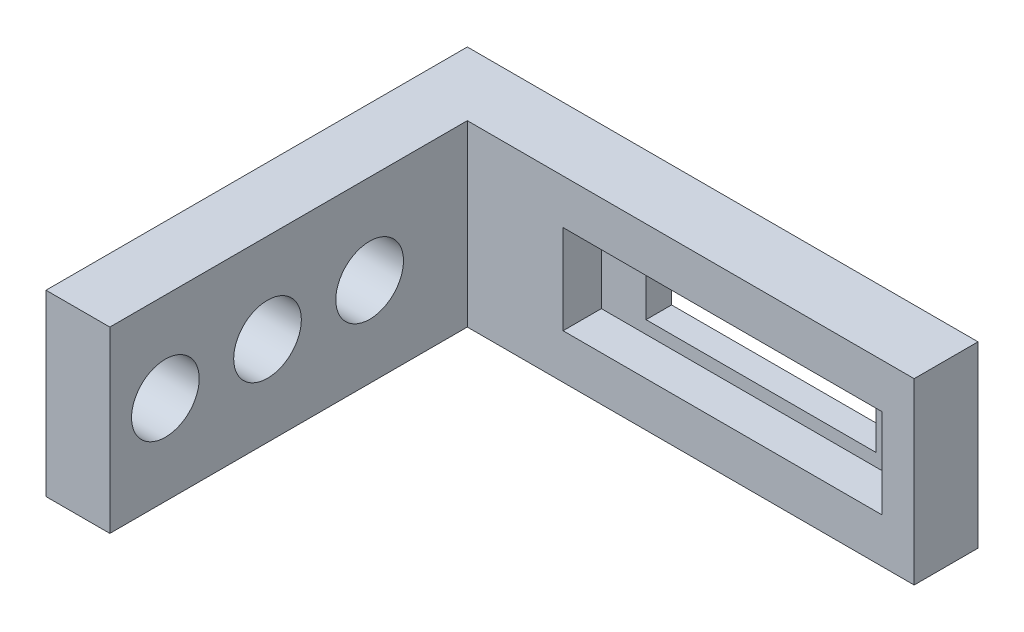
ISO-10303-21;
HEADER;
FILE_DESCRIPTION(('STEP AP214'),'2;1');
FILE_NAME('part.step','',(''),(''),'','','');
FILE_SCHEMA(('AUTOMOTIVE_DESIGN { 1 0 10303 214 1 1 1 1 }'));
ENDSEC;
DATA;
#1=APPLICATION_CONTEXT('core data for automotive mechanical design processes');
#2=APPLICATION_PROTOCOL_DEFINITION('international standard','automotive_design',2000,#1);
#3=PRODUCT_CONTEXT('',#1,'mechanical');
#4=PRODUCT('Part','Part','',(#3));
#5=PRODUCT_RELATED_PRODUCT_CATEGORY('part','',(#4));
#6=PRODUCT_DEFINITION_FORMATION('','',#4);
#7=PRODUCT_DEFINITION_CONTEXT('part definition',#1,'design');
#8=PRODUCT_DEFINITION('design','',#6,#7);
#9=PRODUCT_DEFINITION_SHAPE('','',#8);
#10=(LENGTH_UNIT() NAMED_UNIT(*) SI_UNIT(.MILLI.,.METRE.));
#11=(NAMED_UNIT(*) PLANE_ANGLE_UNIT() SI_UNIT($,.RADIAN.));
#12=(NAMED_UNIT(*) SI_UNIT($,.STERADIAN.) SOLID_ANGLE_UNIT());
#13=UNCERTAINTY_MEASURE_WITH_UNIT(LENGTH_MEASURE(1.E-05),#10,'distance_accuracy_value','');
#14=(GEOMETRIC_REPRESENTATION_CONTEXT(3) GLOBAL_UNCERTAINTY_ASSIGNED_CONTEXT((#13)) GLOBAL_UNIT_ASSIGNED_CONTEXT((#10,
#11,#12)) REPRESENTATION_CONTEXT('',''));
#15=CARTESIAN_POINT('',(0.,0.,0.));
#16=DIRECTION('',(0.,0.,1.));
#17=DIRECTION('',(1.,0.,0.));
#18=AXIS2_PLACEMENT_3D('',#15,#16,#17);
#19=CARTESIAN_POINT('',(10.,14.,-4.));
#20=DIRECTION('',(0.,0.,-1.));
#21=DIRECTION('',(-1.,0.,0.));
#22=AXIS2_PLACEMENT_3D('',#19,#20,#21);
#23=PLANE('',#22);
#24=DIRECTION('',(-1.,0.,0.));
#25=VECTOR('',#24,1.);
#26=CARTESIAN_POINT('',(37.5,10.5,-4.));
#27=LINE('',#26,#25);
#28=CARTESIAN_POINT('',(37.5,10.5,-4.));
#29=VERTEX_POINT('',#28);
#30=CARTESIAN_POINT('',(12.5,10.5,-4.));
#31=VERTEX_POINT('',#30);
#32=EDGE_CURVE('E268',#29,#31,#27,.T.);
#33=ORIENTED_EDGE('',*,*,#32,.F.);
#34=DIRECTION('',(0.,1.,0.));
#35=VECTOR('',#34,1.);
#36=CARTESIAN_POINT('',(37.5,3.50000000000001,-4.));
#37=LINE('',#36,#35);
#38=CARTESIAN_POINT('',(37.5,3.50000000000001,-4.));
#39=VERTEX_POINT('',#38);
#40=EDGE_CURVE('E239',#39,#29,#37,.T.);
#41=ORIENTED_EDGE('',*,*,#40,.F.);
#42=DIRECTION('',(1.,0.,0.));
#43=VECTOR('',#42,1.);
#44=CARTESIAN_POINT('',(37.5,3.50000000000001,-4.));
#45=LINE('',#44,#43);
#46=CARTESIAN_POINT('',(12.5,3.49999999999999,-4.));
#47=VERTEX_POINT('',#46);
#48=EDGE_CURVE('E253',#47,#39,#45,.T.);
#49=ORIENTED_EDGE('',*,*,#48,.F.);
#50=DIRECTION('',(0.,-1.,0.));
#51=VECTOR('',#50,1.);
#52=CARTESIAN_POINT('',(12.5,3.49999999999999,-4.));
#53=LINE('',#52,#51);
#54=EDGE_CURVE('E272',#31,#47,#53,.T.);
#55=ORIENTED_EDGE('',*,*,#54,.F.);
#56=EDGE_LOOP('',(#33,#41,#49,#55));
#57=FACE_BOUND('',#56,.T.);
#58=DIRECTION('',(1.,0.,0.));
#59=VECTOR('',#58,1.);
#60=CARTESIAN_POINT('',(10.,0.,-4.));
#61=LINE('',#60,#59);
#62=CARTESIAN_POINT('',(5.,0.,-4.));
#63=VERTEX_POINT('',#62);
#64=CARTESIAN_POINT('',(40.,0.,-4.));
#65=VERTEX_POINT('',#64);
#66=EDGE_CURVE('E139',#63,#65,#61,.T.);
#67=ORIENTED_EDGE('',*,*,#66,.T.);
#68=DIRECTION('',(0.,-1.,0.));
#69=VECTOR('',#68,1.);
#70=CARTESIAN_POINT('',(40.,14.,-4.));
#71=LINE('',#70,#69);
#72=CARTESIAN_POINT('',(40.,14.,-4.));
#73=VERTEX_POINT('',#72);
#74=EDGE_CURVE('E11',#73,#65,#71,.T.);
#75=ORIENTED_EDGE('',*,*,#74,.F.);
#76=DIRECTION('',(1.,0.,0.));
#77=VECTOR('',#76,1.);
#78=CARTESIAN_POINT('',(10.,14.,-4.));
#79=LINE('',#78,#77);
#80=CARTESIAN_POINT('',(5.,14.,-4.));
#81=VERTEX_POINT('',#80);
#82=EDGE_CURVE('E163',#81,#73,#79,.T.);
#83=ORIENTED_EDGE('',*,*,#82,.F.);
#84=DIRECTION('',(0.,1.,0.));
#85=VECTOR('',#84,1.);
#86=CARTESIAN_POINT('',(5.,0.,-4.));
#87=LINE('',#86,#85);
#88=EDGE_CURVE('E156',#63,#81,#87,.T.);
#89=ORIENTED_EDGE('',*,*,#88,.F.);
#90=EDGE_LOOP('',(#67,#75,#83,#89));
#91=FACE_BOUND('',#90,.T.);
#92=ADVANCED_FACE('F39',(#57,#91),#23,.F.);
#93=CARTESIAN_POINT('',(40.,14.,-9.));
#94=DIRECTION('',(-1.,0.,0.));
#95=DIRECTION('',(0.,0.,1.));
#96=AXIS2_PLACEMENT_3D('',#93,#94,#95);
#97=PLANE('',#96);
#98=DIRECTION('',(0.,0.,-1.));
#99=VECTOR('',#98,1.);
#100=CARTESIAN_POINT('',(40.,0.,-9.));
#101=LINE('',#100,#99);
#102=CARTESIAN_POINT('',(40.,0.,-9.));
#103=VERTEX_POINT('',#102);
#104=EDGE_CURVE('E145',#65,#103,#101,.T.);
#105=ORIENTED_EDGE('',*,*,#104,.T.);
#106=DIRECTION('',(0.,-1.,0.));
#107=VECTOR('',#106,1.);
#108=CARTESIAN_POINT('',(40.,14.,-9.));
#109=LINE('',#108,#107);
#110=CARTESIAN_POINT('',(40.,14.,-9.));
#111=VERTEX_POINT('',#110);
#112=EDGE_CURVE('E47',#111,#103,#109,.T.);
#113=ORIENTED_EDGE('',*,*,#112,.F.);
#114=DIRECTION('',(0.,0.,-1.));
#115=VECTOR('',#114,1.);
#116=CARTESIAN_POINT('',(40.,14.,-9.));
#117=LINE('',#116,#115);
#118=EDGE_CURVE('E292',#73,#111,#117,.T.);
#119=ORIENTED_EDGE('',*,*,#118,.F.);
#120=ORIENTED_EDGE('',*,*,#74,.T.);
#121=EDGE_LOOP('',(#105,#113,#119,#120));
#122=FACE_BOUND('',#121,.T.);
#123=ADVANCED_FACE('F321',(#122),#97,.F.);
#124=CARTESIAN_POINT('',(0.,14.,-9.));
#125=DIRECTION('',(0.,0.,1.));
#126=DIRECTION('',(1.,0.,0.));
#127=AXIS2_PLACEMENT_3D('',#124,#125,#126);
#128=PLANE('',#127);
#129=DIRECTION('',(-1.,0.,0.));
#130=VECTOR('',#129,1.);
#131=CARTESIAN_POINT('',(34.,9.50000000000001,-9.));
#132=LINE('',#131,#130);
#133=CARTESIAN_POINT('',(34.,9.50000000000001,-9.));
#134=VERTEX_POINT('',#133);
#135=CARTESIAN_POINT('',(16.,9.50000000000001,-9.));
#136=VERTEX_POINT('',#135);
#137=EDGE_CURVE('E219',#134,#136,#132,.T.);
#138=ORIENTED_EDGE('',*,*,#137,.T.);
#139=DIRECTION('',(0.,-1.,0.));
#140=VECTOR('',#139,1.);
#141=CARTESIAN_POINT('',(16.,9.50000000000001,-9.));
#142=LINE('',#141,#140);
#143=CARTESIAN_POINT('',(16.,4.5,-9.));
#144=VERTEX_POINT('',#143);
#145=EDGE_CURVE('E208',#136,#144,#142,.T.);
#146=ORIENTED_EDGE('',*,*,#145,.T.);
#147=DIRECTION('',(1.,0.,0.));
#148=VECTOR('',#147,1.);
#149=CARTESIAN_POINT('',(34.,4.50000000000001,-9.));
#150=LINE('',#149,#148);
#151=CARTESIAN_POINT('',(34.,4.50000000000001,-9.));
#152=VERTEX_POINT('',#151);
#153=EDGE_CURVE('E212',#144,#152,#150,.T.);
#154=ORIENTED_EDGE('',*,*,#153,.T.);
#155=DIRECTION('',(0.,1.,0.));
#156=VECTOR('',#155,1.);
#157=CARTESIAN_POINT('',(34.,9.50000000000001,-9.));
#158=LINE('',#157,#156);
#159=EDGE_CURVE('E59',#152,#134,#158,.T.);
#160=ORIENTED_EDGE('',*,*,#159,.T.);
#161=EDGE_LOOP('',(#138,#146,#154,#160));
#162=FACE_BOUND('',#161,.T.);
#163=DIRECTION('',(-1.,0.,0.));
#164=VECTOR('',#163,1.);
#165=CARTESIAN_POINT('',(0.,0.,-9.));
#166=LINE('',#165,#164);
#167=CARTESIAN_POINT('',(0.,0.,-9.));
#168=VERTEX_POINT('',#167);
#169=EDGE_CURVE('E305',#103,#168,#166,.T.);
#170=ORIENTED_EDGE('',*,*,#169,.T.);
#171=DIRECTION('',(0.,-1.,0.));
#172=VECTOR('',#171,1.);
#173=CARTESIAN_POINT('',(0.,14.,-9.));
#174=LINE('',#173,#172);
#175=CARTESIAN_POINT('',(0.,14.,-9.));
#176=VERTEX_POINT('',#175);
#177=EDGE_CURVE('E301',#176,#168,#174,.T.);
#178=ORIENTED_EDGE('',*,*,#177,.F.);
#179=DIRECTION('',(-1.,0.,0.));
#180=VECTOR('',#179,1.);
#181=CARTESIAN_POINT('',(11.5890955973018,14.,-9.));
#182=LINE('',#181,#180);
#183=EDGE_CURVE('E296',#111,#176,#182,.T.);
#184=ORIENTED_EDGE('',*,*,#183,.F.);
#185=ORIENTED_EDGE('',*,*,#112,.T.);
#186=EDGE_LOOP('',(#170,#178,#184,#185));
#187=FACE_BOUND('',#186,.T.);
#188=ADVANCED_FACE('F317',(#162,#187),#128,.F.);
#189=CARTESIAN_POINT('',(0.,14.,0.));
#190=DIRECTION('',(1.,0.,0.));
#191=DIRECTION('',(0.,0.,-1.));
#192=AXIS2_PLACEMENT_3D('',#189,#190,#191);
#193=PLANE('',#192);
#194=CARTESIAN_POINT('',(0.,6.99999999999999,3.65));
#195=DIRECTION('',(-1.,0.,0.));
#196=DIRECTION('',(0.,0.,1.));
#197=AXIS2_PLACEMENT_3D('',#194,#195,#196);
#198=CIRCLE('',#197,2.65);
#199=CARTESIAN_POINT('',(0.,6.99999999999999,6.3));
#200=VERTEX_POINT('',#199);
#201=EDGE_CURVE('E177',#200,#200,#198,.T.);
#202=ORIENTED_EDGE('',*,*,#201,.F.);
#203=EDGE_LOOP('',(#202));
#204=FACE_BOUND('',#203,.T.);
#205=CARTESIAN_POINT('',(0.,6.99999999999999,11.65));
#206=DIRECTION('',(-1.,0.,0.));
#207=DIRECTION('',(0.,0.,1.));
#208=AXIS2_PLACEMENT_3D('',#205,#206,#207);
#209=CIRCLE('',#208,2.65);
#210=CARTESIAN_POINT('',(0.,6.99999999999999,14.3));
#211=VERTEX_POINT('',#210);
#212=EDGE_CURVE('E178',#211,#211,#209,.T.);
#213=ORIENTED_EDGE('',*,*,#212,.F.);
#214=EDGE_LOOP('',(#213));
#215=FACE_BOUND('',#214,.T.);
#216=CARTESIAN_POINT('',(0.,6.99999999999999,19.65));
#217=DIRECTION('',(-1.,0.,0.));
#218=DIRECTION('',(0.,0.,1.));
#219=AXIS2_PLACEMENT_3D('',#216,#217,#218);
#220=CIRCLE('',#219,2.65);
#221=CARTESIAN_POINT('',(0.,6.99999999999999,22.3));
#222=VERTEX_POINT('',#221);
#223=EDGE_CURVE('E170',#222,#222,#220,.T.);
#224=ORIENTED_EDGE('',*,*,#223,.F.);
#225=EDGE_LOOP('',(#224));
#226=FACE_BOUND('',#225,.T.);
#227=DIRECTION('',(0.,0.,1.));
#228=VECTOR('',#227,1.);
#229=CARTESIAN_POINT('',(0.,0.,0.));
#230=LINE('',#229,#228);
#231=CARTESIAN_POINT('',(0.,0.,24.));
#232=VERTEX_POINT('',#231);
#233=EDGE_CURVE('E293',#168,#232,#230,.T.);
#234=ORIENTED_EDGE('',*,*,#233,.T.);
#235=DIRECTION('',(0.,1.,0.));
#236=VECTOR('',#235,1.);
#237=CARTESIAN_POINT('',(0.,0.,24.));
#238=LINE('',#237,#236);
#239=CARTESIAN_POINT('',(0.,14.,24.));
#240=VERTEX_POINT('',#239);
#241=EDGE_CURVE('E161',#232,#240,#238,.T.);
#242=ORIENTED_EDGE('',*,*,#241,.T.);
#243=DIRECTION('',(0.,0.,1.));
#244=VECTOR('',#243,1.);
#245=CARTESIAN_POINT('',(0.,14.,0.));
#246=LINE('',#245,#244);
#247=EDGE_CURVE('E299',#176,#240,#246,.T.);
#248=ORIENTED_EDGE('',*,*,#247,.F.);
#249=ORIENTED_EDGE('',*,*,#177,.T.);
#250=EDGE_LOOP('',(#234,#242,#248,#249));
#251=FACE_BOUND('',#250,.T.);
#252=ADVANCED_FACE('F330',(#204,#215,#226,#251),#193,.F.);
#253=CARTESIAN_POINT('',(0.,14.,0.));
#254=DIRECTION('',(0.,-1.,0.));
#255=DIRECTION('',(0.,0.,-1.));
#256=AXIS2_PLACEMENT_3D('',#253,#254,#255);
#257=PLANE('',#256);
#258=DIRECTION('',(0.,0.,-1.));
#259=VECTOR('',#258,1.);
#260=CARTESIAN_POINT('',(5.,14.,0.));
#261=LINE('',#260,#259);
#262=CARTESIAN_POINT('',(5.,14.,24.));
#263=VERTEX_POINT('',#262);
#264=EDGE_CURVE('E194',#263,#81,#261,.T.);
#265=ORIENTED_EDGE('',*,*,#264,.T.);
#266=ORIENTED_EDGE('',*,*,#82,.T.);
#267=ORIENTED_EDGE('',*,*,#118,.T.);
#268=ORIENTED_EDGE('',*,*,#183,.T.);
#269=ORIENTED_EDGE('',*,*,#247,.T.);
#270=DIRECTION('',(-1.,0.,0.));
#271=VECTOR('',#270,1.);
#272=CARTESIAN_POINT('',(5.,14.,24.));
#273=LINE('',#272,#271);
#274=EDGE_CURVE('E201',#263,#240,#273,.T.);
#275=ORIENTED_EDGE('',*,*,#274,.F.);
#276=EDGE_LOOP('',(#265,#266,#267,#268,#269,#275));
#277=FACE_BOUND('',#276,.T.);
#278=ADVANCED_FACE('F323',(#277),#257,.F.);
#279=CARTESIAN_POINT('',(0.,0.,0.));
#280=DIRECTION('',(0.,-1.,0.));
#281=DIRECTION('',(0.,0.,-1.));
#282=AXIS2_PLACEMENT_3D('',#279,#280,#281);
#283=PLANE('',#282);
#284=ORIENTED_EDGE('',*,*,#66,.F.);
#285=DIRECTION('',(0.,0.,1.));
#286=VECTOR('',#285,1.);
#287=CARTESIAN_POINT('',(5.,0.,0.));
#288=LINE('',#287,#286);
#289=CARTESIAN_POINT('',(5.,0.,24.));
#290=VERTEX_POINT('',#289);
#291=EDGE_CURVE('E143',#63,#290,#288,.T.);
#292=ORIENTED_EDGE('',*,*,#291,.T.);
#293=DIRECTION('',(-1.,0.,0.));
#294=VECTOR('',#293,1.);
#295=CARTESIAN_POINT('',(5.,0.,24.));
#296=LINE('',#295,#294);
#297=EDGE_CURVE('E197',#290,#232,#296,.T.);
#298=ORIENTED_EDGE('',*,*,#297,.T.);
#299=ORIENTED_EDGE('',*,*,#233,.F.);
#300=ORIENTED_EDGE('',*,*,#169,.F.);
#301=ORIENTED_EDGE('',*,*,#104,.F.);
#302=EDGE_LOOP('',(#284,#292,#298,#299,#300,#301));
#303=FACE_BOUND('',#302,.T.);
#304=ADVANCED_FACE('F141',(#303),#283,.T.);
#305=CARTESIAN_POINT('',(37.5,3.50000000000001,-7.));
#306=DIRECTION('',(1.,0.,0.));
#307=DIRECTION('',(0.,0.,-1.));
#308=AXIS2_PLACEMENT_3D('',#305,#306,#307);
#309=PLANE('',#308);
#310=ORIENTED_EDGE('',*,*,#40,.T.);
#311=DIRECTION('',(0.,0.,1.));
#312=VECTOR('',#311,1.);
#313=CARTESIAN_POINT('',(37.5,10.5,-7.));
#314=LINE('',#313,#312);
#315=CARTESIAN_POINT('',(37.5,10.5,-7.));
#316=VERTEX_POINT('',#315);
#317=EDGE_CURVE('E265',#316,#29,#314,.T.);
#318=ORIENTED_EDGE('',*,*,#317,.F.);
#319=DIRECTION('',(0.,1.,0.));
#320=VECTOR('',#319,1.);
#321=CARTESIAN_POINT('',(37.5,3.50000000000001,-7.));
#322=LINE('',#321,#320);
#323=CARTESIAN_POINT('',(37.5,3.50000000000001,-7.));
#324=VERTEX_POINT('',#323);
#325=EDGE_CURVE('E248',#324,#316,#322,.T.);
#326=ORIENTED_EDGE('',*,*,#325,.F.);
#327=DIRECTION('',(0.,0.,1.));
#328=VECTOR('',#327,1.);
#329=CARTESIAN_POINT('',(37.5,3.50000000000001,-7.));
#330=LINE('',#329,#328);
#331=EDGE_CURVE('E150',#324,#39,#330,.T.);
#332=ORIENTED_EDGE('',*,*,#331,.T.);
#333=EDGE_LOOP('',(#310,#318,#326,#332));
#334=FACE_BOUND('',#333,.T.);
#335=ADVANCED_FACE('F359',(#334),#309,.F.);
#336=CARTESIAN_POINT('',(37.5,3.50000000000001,-7.));
#337=DIRECTION('',(0.,-1.,0.));
#338=DIRECTION('',(1.,0.,0.));
#339=AXIS2_PLACEMENT_3D('',#336,#337,#338);
#340=PLANE('',#339);
#341=ORIENTED_EDGE('',*,*,#48,.T.);
#342=ORIENTED_EDGE('',*,*,#331,.F.);
#343=DIRECTION('',(1.,0.,0.));
#344=VECTOR('',#343,1.);
#345=CARTESIAN_POINT('',(37.5,3.50000000000001,-7.));
#346=LINE('',#345,#344);
#347=CARTESIAN_POINT('',(12.5,3.49999999999999,-7.));
#348=VERTEX_POINT('',#347);
#349=EDGE_CURVE('E261',#348,#324,#346,.T.);
#350=ORIENTED_EDGE('',*,*,#349,.F.);
#351=DIRECTION('',(0.,0.,1.));
#352=VECTOR('',#351,1.);
#353=CARTESIAN_POINT('',(12.5,3.49999999999999,-7.));
#354=LINE('',#353,#352);
#355=EDGE_CURVE('E281',#348,#47,#354,.T.);
#356=ORIENTED_EDGE('',*,*,#355,.T.);
#357=EDGE_LOOP('',(#341,#342,#350,#356));
#358=FACE_BOUND('',#357,.T.);
#359=ADVANCED_FACE('F362',(#358),#340,.F.);
#360=CARTESIAN_POINT('',(12.5,3.49999999999999,-7.));
#361=DIRECTION('',(-1.,0.,0.));
#362=DIRECTION('',(0.,0.,1.));
#363=AXIS2_PLACEMENT_3D('',#360,#361,#362);
#364=PLANE('',#363);
#365=ORIENTED_EDGE('',*,*,#54,.T.);
#366=ORIENTED_EDGE('',*,*,#355,.F.);
#367=DIRECTION('',(0.,-1.,0.));
#368=VECTOR('',#367,1.);
#369=CARTESIAN_POINT('',(12.5,3.49999999999999,-7.));
#370=LINE('',#369,#368);
#371=CARTESIAN_POINT('',(12.5,10.5,-7.));
#372=VERTEX_POINT('',#371);
#373=EDGE_CURVE('E257',#372,#348,#370,.T.);
#374=ORIENTED_EDGE('',*,*,#373,.F.);
#375=DIRECTION('',(0.,0.,1.));
#376=VECTOR('',#375,1.);
#377=CARTESIAN_POINT('',(12.5,10.5,-7.));
#378=LINE('',#377,#376);
#379=EDGE_CURVE('E284',#372,#31,#378,.T.);
#380=ORIENTED_EDGE('',*,*,#379,.T.);
#381=EDGE_LOOP('',(#365,#366,#374,#380));
#382=FACE_BOUND('',#381,.T.);
#383=ADVANCED_FACE('F364',(#382),#364,.F.);
#384=CARTESIAN_POINT('',(37.5,10.5,-7.));
#385=DIRECTION('',(0.,1.,0.));
#386=DIRECTION('',(-1.,0.,0.));
#387=AXIS2_PLACEMENT_3D('',#384,#385,#386);
#388=PLANE('',#387);
#389=ORIENTED_EDGE('',*,*,#32,.T.);
#390=ORIENTED_EDGE('',*,*,#379,.F.);
#391=DIRECTION('',(-1.,0.,0.));
#392=VECTOR('',#391,1.);
#393=CARTESIAN_POINT('',(37.5,10.5,-7.));
#394=LINE('',#393,#392);
#395=EDGE_CURVE('E252',#316,#372,#394,.T.);
#396=ORIENTED_EDGE('',*,*,#395,.F.);
#397=ORIENTED_EDGE('',*,*,#317,.T.);
#398=EDGE_LOOP('',(#389,#390,#396,#397));
#399=FACE_BOUND('',#398,.T.);
#400=ADVANCED_FACE('F354',(#399),#388,.F.);
#401=CARTESIAN_POINT('',(0.,0.,-7.));
#402=DIRECTION('',(0.,0.,1.));
#403=DIRECTION('',(1.,0.,0.));
#404=AXIS2_PLACEMENT_3D('',#401,#402,#403);
#405=PLANE('',#404);
#406=DIRECTION('',(0.,-1.,0.));
#407=VECTOR('',#406,1.);
#408=CARTESIAN_POINT('',(16.,9.50000000000001,-7.));
#409=LINE('',#408,#407);
#410=CARTESIAN_POINT('',(16.,9.50000000000001,-7.));
#411=VERTEX_POINT('',#410);
#412=CARTESIAN_POINT('',(16.,4.5,-7.));
#413=VERTEX_POINT('',#412);
#414=EDGE_CURVE('E205',#411,#413,#409,.T.);
#415=ORIENTED_EDGE('',*,*,#414,.F.);
#416=DIRECTION('',(-1.,0.,0.));
#417=VECTOR('',#416,1.);
#418=CARTESIAN_POINT('',(34.,9.50000000000001,-7.));
#419=LINE('',#418,#417);
#420=CARTESIAN_POINT('',(34.,9.50000000000001,-7.));
#421=VERTEX_POINT('',#420);
#422=EDGE_CURVE('E213',#421,#411,#419,.T.);
#423=ORIENTED_EDGE('',*,*,#422,.F.);
#424=DIRECTION('',(0.,1.,0.));
#425=VECTOR('',#424,1.);
#426=CARTESIAN_POINT('',(34.,9.50000000000001,-7.));
#427=LINE('',#426,#425);
#428=CARTESIAN_POINT('',(34.,4.50000000000001,-7.));
#429=VERTEX_POINT('',#428);
#430=EDGE_CURVE('E54',#429,#421,#427,.T.);
#431=ORIENTED_EDGE('',*,*,#430,.F.);
#432=DIRECTION('',(1.,0.,0.));
#433=VECTOR('',#432,1.);
#434=CARTESIAN_POINT('',(34.,4.50000000000001,-7.));
#435=LINE('',#434,#433);
#436=EDGE_CURVE('E227',#413,#429,#435,.T.);
#437=ORIENTED_EDGE('',*,*,#436,.F.);
#438=EDGE_LOOP('',(#415,#423,#431,#437));
#439=FACE_BOUND('',#438,.T.);
#440=ORIENTED_EDGE('',*,*,#325,.T.);
#441=ORIENTED_EDGE('',*,*,#395,.T.);
#442=ORIENTED_EDGE('',*,*,#373,.T.);
#443=ORIENTED_EDGE('',*,*,#349,.T.);
#444=EDGE_LOOP('',(#440,#441,#442,#443));
#445=FACE_BOUND('',#444,.T.);
#446=ADVANCED_FACE('F366',(#439,#445),#405,.T.);
#447=CARTESIAN_POINT('',(16.,9.50000000000001,-9.));
#448=DIRECTION('',(-1.,0.,0.));
#449=DIRECTION('',(0.,0.,1.));
#450=AXIS2_PLACEMENT_3D('',#447,#448,#449);
#451=PLANE('',#450);
#452=ORIENTED_EDGE('',*,*,#414,.T.);
#453=DIRECTION('',(0.,0.,1.));
#454=VECTOR('',#453,1.);
#455=CARTESIAN_POINT('',(16.,4.5,-9.));
#456=LINE('',#455,#454);
#457=EDGE_CURVE('E223',#144,#413,#456,.T.);
#458=ORIENTED_EDGE('',*,*,#457,.F.);
#459=ORIENTED_EDGE('',*,*,#145,.F.);
#460=DIRECTION('',(0.,0.,1.));
#461=VECTOR('',#460,1.);
#462=CARTESIAN_POINT('',(16.,9.50000000000001,-9.));
#463=LINE('',#462,#461);
#464=EDGE_CURVE('E236',#136,#411,#463,.T.);
#465=ORIENTED_EDGE('',*,*,#464,.T.);
#466=EDGE_LOOP('',(#452,#458,#459,#465));
#467=FACE_BOUND('',#466,.T.);
#468=ADVANCED_FACE('F368',(#467),#451,.F.);
#469=CARTESIAN_POINT('',(34.,9.50000000000001,-9.));
#470=DIRECTION('',(0.,1.,0.));
#471=DIRECTION('',(-1.,0.,0.));
#472=AXIS2_PLACEMENT_3D('',#469,#470,#471);
#473=PLANE('',#472);
#474=ORIENTED_EDGE('',*,*,#422,.T.);
#475=ORIENTED_EDGE('',*,*,#464,.F.);
#476=ORIENTED_EDGE('',*,*,#137,.F.);
#477=DIRECTION('',(0.,0.,1.));
#478=VECTOR('',#477,1.);
#479=CARTESIAN_POINT('',(34.,9.50000000000001,-9.));
#480=LINE('',#479,#478);
#481=EDGE_CURVE('E240',#134,#421,#480,.T.);
#482=ORIENTED_EDGE('',*,*,#481,.T.);
#483=EDGE_LOOP('',(#474,#475,#476,#482));
#484=FACE_BOUND('',#483,.T.);
#485=ADVANCED_FACE('F375',(#484),#473,.F.);
#486=CARTESIAN_POINT('',(34.,9.50000000000001,-9.));
#487=DIRECTION('',(1.,0.,0.));
#488=DIRECTION('',(0.,0.,-1.));
#489=AXIS2_PLACEMENT_3D('',#486,#487,#488);
#490=PLANE('',#489);
#491=ORIENTED_EDGE('',*,*,#430,.T.);
#492=ORIENTED_EDGE('',*,*,#481,.F.);
#493=ORIENTED_EDGE('',*,*,#159,.F.);
#494=DIRECTION('',(0.,0.,1.));
#495=VECTOR('',#494,1.);
#496=CARTESIAN_POINT('',(34.,4.50000000000001,-9.));
#497=LINE('',#496,#495);
#498=EDGE_CURVE('E243',#152,#429,#497,.T.);
#499=ORIENTED_EDGE('',*,*,#498,.T.);
#500=EDGE_LOOP('',(#491,#492,#493,#499));
#501=FACE_BOUND('',#500,.T.);
#502=ADVANCED_FACE('F436',(#501),#490,.F.);
#503=CARTESIAN_POINT('',(34.,4.50000000000001,-9.));
#504=DIRECTION('',(0.,-1.,0.));
#505=DIRECTION('',(1.,0.,0.));
#506=AXIS2_PLACEMENT_3D('',#503,#504,#505);
#507=PLANE('',#506);
#508=ORIENTED_EDGE('',*,*,#436,.T.);
#509=ORIENTED_EDGE('',*,*,#498,.F.);
#510=ORIENTED_EDGE('',*,*,#153,.F.);
#511=ORIENTED_EDGE('',*,*,#457,.T.);
#512=EDGE_LOOP('',(#508,#509,#510,#511));
#513=FACE_BOUND('',#512,.T.);
#514=ADVANCED_FACE('F446',(#513),#507,.F.);
#515=CARTESIAN_POINT('',(5.,0.,24.));
#516=DIRECTION('',(0.,0.,1.));
#517=DIRECTION('',(1.,0.,0.));
#518=AXIS2_PLACEMENT_3D('',#515,#516,#517);
#519=PLANE('',#518);
#520=ORIENTED_EDGE('',*,*,#241,.F.);
#521=ORIENTED_EDGE('',*,*,#297,.F.);
#522=DIRECTION('',(0.,1.,0.));
#523=VECTOR('',#522,1.);
#524=CARTESIAN_POINT('',(5.,0.,24.));
#525=LINE('',#524,#523);
#526=EDGE_CURVE('E159',#290,#263,#525,.T.);
#527=ORIENTED_EDGE('',*,*,#526,.T.);
#528=ORIENTED_EDGE('',*,*,#274,.T.);
#529=EDGE_LOOP('',(#520,#521,#527,#528));
#530=FACE_BOUND('',#529,.T.);
#531=ADVANCED_FACE('F327',(#530),#519,.T.);
#532=CARTESIAN_POINT('',(5.,0.,0.));
#533=DIRECTION('',(1.,0.,0.));
#534=DIRECTION('',(0.,0.,-1.));
#535=AXIS2_PLACEMENT_3D('',#532,#533,#534);
#536=PLANE('',#535);
#537=CARTESIAN_POINT('',(5.,6.99999999999999,3.65));
#538=DIRECTION('',(1.,0.,0.));
#539=DIRECTION('',(0.,0.,-1.));
#540=AXIS2_PLACEMENT_3D('',#537,#538,#539);
#541=CIRCLE('',#540,2.65);
#542=CARTESIAN_POINT('',(5.,6.99999999999999,1.));
#543=VERTEX_POINT('',#542);
#544=EDGE_CURVE('E173',#543,#543,#541,.F.);
#545=ORIENTED_EDGE('',*,*,#544,.T.);
#546=EDGE_LOOP('',(#545));
#547=FACE_BOUND('',#546,.T.);
#548=CARTESIAN_POINT('',(5.,6.99999999999999,11.65));
#549=DIRECTION('',(1.,0.,0.));
#550=DIRECTION('',(0.,0.,-1.));
#551=AXIS2_PLACEMENT_3D('',#548,#549,#550);
#552=CIRCLE('',#551,2.65);
#553=CARTESIAN_POINT('',(5.,6.99999999999999,9.));
#554=VERTEX_POINT('',#553);
#555=EDGE_CURVE('E182',#554,#554,#552,.F.);
#556=ORIENTED_EDGE('',*,*,#555,.T.);
#557=EDGE_LOOP('',(#556));
#558=FACE_BOUND('',#557,.T.);
#559=CARTESIAN_POINT('',(5.,6.99999999999999,19.65));
#560=DIRECTION('',(1.,0.,0.));
#561=DIRECTION('',(0.,0.,-1.));
#562=AXIS2_PLACEMENT_3D('',#559,#560,#561);
#563=CIRCLE('',#562,2.65);
#564=CARTESIAN_POINT('',(5.,6.99999999999999,17.));
#565=VERTEX_POINT('',#564);
#566=EDGE_CURVE('E166',#565,#565,#563,.F.);
#567=ORIENTED_EDGE('',*,*,#566,.T.);
#568=EDGE_LOOP('',(#567));
#569=FACE_BOUND('',#568,.T.);
#570=ORIENTED_EDGE('',*,*,#291,.F.);
#571=ORIENTED_EDGE('',*,*,#88,.T.);
#572=ORIENTED_EDGE('',*,*,#264,.F.);
#573=ORIENTED_EDGE('',*,*,#526,.F.);
#574=EDGE_LOOP('',(#570,#571,#572,#573));
#575=FACE_BOUND('',#574,.T.);
#576=ADVANCED_FACE('F154',(#547,#558,#569,#575),#536,.T.);
#577=CARTESIAN_POINT('',(12.4953318805774,6.99999999999999,19.65));
#578=DIRECTION('',(-1.,0.,0.));
#579=DIRECTION('',(0.,0.,1.));
#580=AXIS2_PLACEMENT_3D('',#577,#578,#579);
#581=CYLINDRICAL_SURFACE('',#580,2.65);
#582=ORIENTED_EDGE('',*,*,#223,.T.);
#583=EDGE_LOOP('',(#582));
#584=FACE_BOUND('',#583,.T.);
#585=ORIENTED_EDGE('',*,*,#566,.F.);
#586=EDGE_LOOP('',(#585));
#587=FACE_BOUND('',#586,.T.);
#588=ADVANCED_FACE('F470',(#584,#587),#581,.F.);
#589=CARTESIAN_POINT('',(12.4953318805774,6.99999999999999,11.65));
#590=DIRECTION('',(-1.,0.,0.));
#591=DIRECTION('',(0.,0.,1.));
#592=AXIS2_PLACEMENT_3D('',#589,#590,#591);
#593=CYLINDRICAL_SURFACE('',#592,2.65);
#594=ORIENTED_EDGE('',*,*,#212,.T.);
#595=EDGE_LOOP('',(#594));
#596=FACE_BOUND('',#595,.T.);
#597=ORIENTED_EDGE('',*,*,#555,.F.);
#598=EDGE_LOOP('',(#597));
#599=FACE_BOUND('',#598,.T.);
#600=ADVANCED_FACE('F475',(#596,#599),#593,.F.);
#601=CARTESIAN_POINT('',(12.4953318805774,6.99999999999999,3.65));
#602=DIRECTION('',(-1.,0.,0.));
#603=DIRECTION('',(0.,0.,1.));
#604=AXIS2_PLACEMENT_3D('',#601,#602,#603);
#605=CYLINDRICAL_SURFACE('',#604,2.65);
#606=ORIENTED_EDGE('',*,*,#201,.T.);
#607=EDGE_LOOP('',(#606));
#608=FACE_BOUND('',#607,.T.);
#609=ORIENTED_EDGE('',*,*,#544,.F.);
#610=EDGE_LOOP('',(#609));
#611=FACE_BOUND('',#610,.T.);
#612=ADVANCED_FACE('F485',(#608,#611),#605,.F.);
#613=CLOSED_SHELL('',(#92,#123,#188,#252,#278,#304,#335,#359,#383,#400,#446,#468,#485,#502,#514,
#531,#576,#588,#600,#612));
#614=MANIFOLD_SOLID_BREP('B2',#613);
#615=ADVANCED_BREP_SHAPE_REPRESENTATION('',(#18,#614),#14);
#616=SHAPE_DEFINITION_REPRESENTATION(#9,#615);
ENDSEC;
END-ISO-10303-21;
